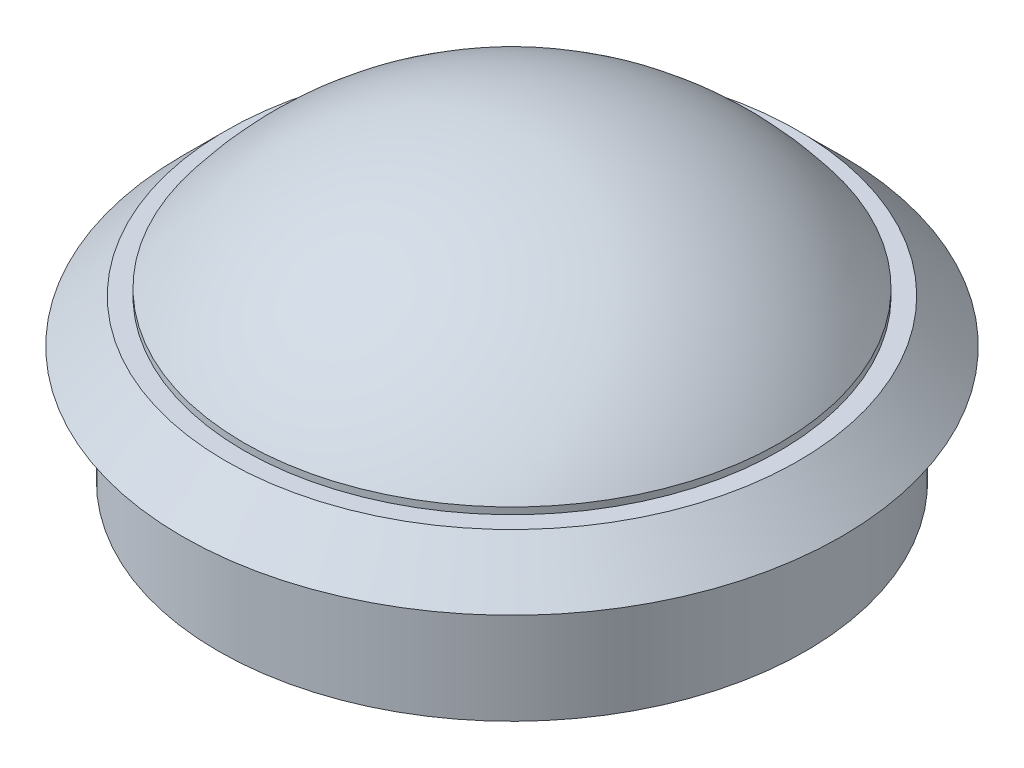
ISO-10303-21;
HEADER;
FILE_DESCRIPTION(('STEP AP214'),'2;1');
FILE_NAME('part.step','',(''),(''),'','','');
FILE_SCHEMA(('AUTOMOTIVE_DESIGN { 1 0 10303 214 1 1 1 1 }'));
ENDSEC;
DATA;
#1=APPLICATION_CONTEXT('core data for automotive mechanical design processes');
#2=APPLICATION_PROTOCOL_DEFINITION('international standard','automotive_design',2000,#1);
#3=PRODUCT_CONTEXT('',#1,'mechanical');
#4=PRODUCT('Part','Part','',(#3));
#5=PRODUCT_RELATED_PRODUCT_CATEGORY('part','',(#4));
#6=PRODUCT_DEFINITION_FORMATION('','',#4);
#7=PRODUCT_DEFINITION_CONTEXT('part definition',#1,'design');
#8=PRODUCT_DEFINITION('design','',#6,#7);
#9=PRODUCT_DEFINITION_SHAPE('','',#8);
#10=(LENGTH_UNIT() NAMED_UNIT(*) SI_UNIT(.MILLI.,.METRE.));
#11=(NAMED_UNIT(*) PLANE_ANGLE_UNIT() SI_UNIT($,.RADIAN.));
#12=(NAMED_UNIT(*) SI_UNIT($,.STERADIAN.) SOLID_ANGLE_UNIT());
#13=UNCERTAINTY_MEASURE_WITH_UNIT(LENGTH_MEASURE(1.E-05),#10,'distance_accuracy_value','');
#14=(GEOMETRIC_REPRESENTATION_CONTEXT(3) GLOBAL_UNCERTAINTY_ASSIGNED_CONTEXT((#13)) GLOBAL_UNIT_ASSIGNED_CONTEXT((#10,
#11,#12)) REPRESENTATION_CONTEXT('',''));
#15=CARTESIAN_POINT('',(0.,0.,0.));
#16=DIRECTION('',(0.,0.,1.));
#17=DIRECTION('',(1.,0.,0.));
#18=AXIS2_PLACEMENT_3D('',#15,#16,#17);
#19=CARTESIAN_POINT('',(0.,0.,0.));
#20=DIRECTION('',(0.,-1.,0.));
#21=DIRECTION('',(0.,0.,-1.));
#22=AXIS2_PLACEMENT_3D('',#19,#20,#21);
#23=PLANE('',#22);
#24=CARTESIAN_POINT('',(0.,0.,0.));
#25=DIRECTION('',(0.,1.,0.));
#26=DIRECTION('',(0.,0.,1.));
#27=AXIS2_PLACEMENT_3D('',#24,#25,#26);
#28=CIRCLE('',#27,43.9);
#29=CARTESIAN_POINT('',(0.,0.,43.9));
#30=VERTEX_POINT('',#29);
#31=EDGE_CURVE('E70',#30,#30,#28,.T.);
#32=ORIENTED_EDGE('',*,*,#31,.F.);
#33=EDGE_LOOP('',(#32));
#34=FACE_BOUND('',#33,.T.);
#35=ADVANCED_FACE('F43',(#34),#23,.T.);
#36=CARTESIAN_POINT('',(0.,-5.08157799063878,0.));
#37=DIRECTION('',(0.,1.,0.));
#38=DIRECTION('',(1.,0.,0.));
#39=AXIS2_PLACEMENT_3D('',#36,#37,#38);
#40=SPHERICAL_SURFACE('',#39,50.0815779906388);
#41=CARTESIAN_POINT('',(0.,25.,0.));
#42=DIRECTION('',(0.,1.,0.));
#43=DIRECTION('',(0.,0.,1.));
#44=AXIS2_PLACEMENT_3D('',#41,#42,#43);
#45=CIRCLE('',#44,40.0407682197227);
#46=CARTESIAN_POINT('',(0.,25.,40.0407682197227));
#47=VERTEX_POINT('',#46);
#48=EDGE_CURVE('E10',#47,#47,#45,.T.);
#49=ORIENTED_EDGE('',*,*,#48,.T.);
#50=EDGE_LOOP('',(#49));
#51=FACE_BOUND('',#50,.T.);
#52=ADVANCED_FACE('F79',(#51),#40,.T.);
#53=CARTESIAN_POINT('',(0.,50.0709521662922,0.));
#54=DIRECTION('',(0.,1.,0.));
#55=DIRECTION('',(0.,0.,1.));
#56=AXIS2_PLACEMENT_3D('',#53,#54,#55);
#57=CYLINDRICAL_SURFACE('',#56,40.0407682197227);
#58=CARTESIAN_POINT('',(0.,24.,0.));
#59=DIRECTION('',(0.,1.,0.));
#60=DIRECTION('',(0.,0.,1.));
#61=AXIS2_PLACEMENT_3D('',#58,#59,#60);
#62=CIRCLE('',#61,40.0407682197227);
#63=CARTESIAN_POINT('',(0.,24.,40.0407682197227));
#64=VERTEX_POINT('',#63);
#65=EDGE_CURVE('E50',#64,#64,#62,.T.);
#66=ORIENTED_EDGE('',*,*,#65,.T.);
#67=EDGE_LOOP('',(#66));
#68=FACE_BOUND('',#67,.T.);
#69=ORIENTED_EDGE('',*,*,#48,.F.);
#70=EDGE_LOOP('',(#69));
#71=FACE_BOUND('',#70,.T.);
#72=ADVANCED_FACE('F83',(#68,#71),#57,.T.);
#73=CARTESIAN_POINT('',(-42.7499999999999,24.,0.));
#74=DIRECTION('',(0.,1.,0.));
#75=DIRECTION('',(0.,0.,1.));
#76=AXIS2_PLACEMENT_3D('',#73,#74,#75);
#77=PLANE('',#76);
#78=CARTESIAN_POINT('',(0.,24.,0.));
#79=DIRECTION('',(0.,1.,0.));
#80=DIRECTION('',(0.,0.,1.));
#81=AXIS2_PLACEMENT_3D('',#78,#79,#80);
#82=CIRCLE('',#81,42.7499999999999);
#83=CARTESIAN_POINT('',(0.,24.,42.7499999999999));
#84=VERTEX_POINT('',#83);
#85=EDGE_CURVE('E55',#84,#84,#82,.T.);
#86=ORIENTED_EDGE('',*,*,#85,.T.);
#87=EDGE_LOOP('',(#86));
#88=FACE_BOUND('',#87,.T.);
#89=ORIENTED_EDGE('',*,*,#65,.F.);
#90=EDGE_LOOP('',(#89));
#91=FACE_BOUND('',#90,.T.);
#92=ADVANCED_FACE('F87',(#88,#91),#77,.T.);
#93=CARTESIAN_POINT('',(0.,24.,0.));
#94=DIRECTION('',(0.,-1.,0.));
#95=DIRECTION('',(0.,0.,-1.));
#96=AXIS2_PLACEMENT_3D('',#93,#94,#95);
#97=CONICAL_SURFACE('',#96,42.7499999999999,0.785398163397455);
#98=CARTESIAN_POINT('',(0.,17.5,0.));
#99=DIRECTION('',(0.,1.,0.));
#100=DIRECTION('',(0.,0.,1.));
#101=AXIS2_PLACEMENT_3D('',#98,#99,#100);
#102=CIRCLE('',#101,49.25);
#103=CARTESIAN_POINT('',(0.,17.5,49.25));
#104=VERTEX_POINT('',#103);
#105=EDGE_CURVE('E60',#104,#104,#102,.T.);
#106=ORIENTED_EDGE('',*,*,#105,.T.);
#107=EDGE_LOOP('',(#106));
#108=FACE_BOUND('',#107,.T.);
#109=ORIENTED_EDGE('',*,*,#85,.F.);
#110=EDGE_LOOP('',(#109));
#111=FACE_BOUND('',#110,.T.);
#112=ADVANCED_FACE('F92',(#108,#111),#97,.T.);
#113=CARTESIAN_POINT('',(-43.9,17.5,0.));
#114=DIRECTION('',(0.,-1.,0.));
#115=DIRECTION('',(0.,0.,-1.));
#116=AXIS2_PLACEMENT_3D('',#113,#114,#115);
#117=PLANE('',#116);
#118=CARTESIAN_POINT('',(0.,17.5,0.));
#119=DIRECTION('',(0.,1.,0.));
#120=DIRECTION('',(0.,0.,1.));
#121=AXIS2_PLACEMENT_3D('',#118,#119,#120);
#122=CIRCLE('',#121,43.9);
#123=CARTESIAN_POINT('',(0.,17.5,43.9));
#124=VERTEX_POINT('',#123);
#125=EDGE_CURVE('E66',#124,#124,#122,.T.);
#126=ORIENTED_EDGE('',*,*,#125,.T.);
#127=EDGE_LOOP('',(#126));
#128=FACE_BOUND('',#127,.T.);
#129=ORIENTED_EDGE('',*,*,#105,.F.);
#130=EDGE_LOOP('',(#129));
#131=FACE_BOUND('',#130,.T.);
#132=ADVANCED_FACE('F96',(#128,#131),#117,.T.);
#133=CARTESIAN_POINT('',(0.,50.0709521662922,0.));
#134=DIRECTION('',(0.,1.,0.));
#135=DIRECTION('',(0.,0.,1.));
#136=AXIS2_PLACEMENT_3D('',#133,#134,#135);
#137=CYLINDRICAL_SURFACE('',#136,43.9);
#138=ORIENTED_EDGE('',*,*,#31,.T.);
#139=EDGE_LOOP('',(#138));
#140=FACE_BOUND('',#139,.T.);
#141=ORIENTED_EDGE('',*,*,#125,.F.);
#142=EDGE_LOOP('',(#141));
#143=FACE_BOUND('',#142,.T.);
#144=ADVANCED_FACE('F75',(#140,#143),#137,.T.);
#145=CLOSED_SHELL('',(#35,#52,#72,#92,#112,#132,#144));
#146=MANIFOLD_SOLID_BREP('B2',#145);
#147=ADVANCED_BREP_SHAPE_REPRESENTATION('',(#18,#146),#14);
#148=SHAPE_DEFINITION_REPRESENTATION(#9,#147);
ENDSEC;
END-ISO-10303-21;
